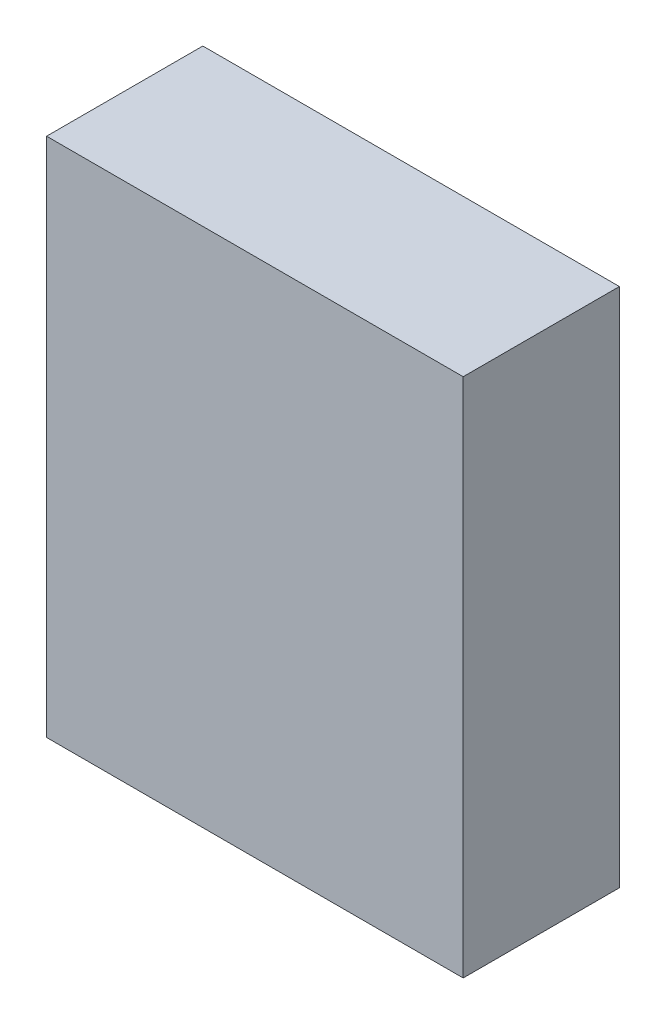
ISO-10303-21;
HEADER;
FILE_DESCRIPTION(('STEP AP214'),'2;1');
FILE_NAME('part.step','',(''),(''),'','','');
FILE_SCHEMA(('AUTOMOTIVE_DESIGN { 1 0 10303 214 1 1 1 1 }'));
ENDSEC;
DATA;
#1=APPLICATION_CONTEXT('core data for automotive mechanical design processes');
#2=APPLICATION_PROTOCOL_DEFINITION('international standard','automotive_design',2000,#1);
#3=PRODUCT_CONTEXT('',#1,'mechanical');
#4=PRODUCT('Part','Part','',(#3));
#5=PRODUCT_RELATED_PRODUCT_CATEGORY('part','',(#4));
#6=PRODUCT_DEFINITION_FORMATION('','',#4);
#7=PRODUCT_DEFINITION_CONTEXT('part definition',#1,'design');
#8=PRODUCT_DEFINITION('design','',#6,#7);
#9=PRODUCT_DEFINITION_SHAPE('','',#8);
#10=(LENGTH_UNIT() NAMED_UNIT(*) SI_UNIT(.MILLI.,.METRE.));
#11=(NAMED_UNIT(*) PLANE_ANGLE_UNIT() SI_UNIT($,.RADIAN.));
#12=(NAMED_UNIT(*) SI_UNIT($,.STERADIAN.) SOLID_ANGLE_UNIT());
#13=UNCERTAINTY_MEASURE_WITH_UNIT(LENGTH_MEASURE(1.E-05),#10,'distance_accuracy_value','');
#14=(GEOMETRIC_REPRESENTATION_CONTEXT(3) GLOBAL_UNCERTAINTY_ASSIGNED_CONTEXT((#13)) GLOBAL_UNIT_ASSIGNED_CONTEXT((#10,
#11,#12)) REPRESENTATION_CONTEXT('',''));
#15=CARTESIAN_POINT('',(0.,0.,0.));
#16=DIRECTION('',(0.,0.,1.));
#17=DIRECTION('',(1.,0.,0.));
#18=AXIS2_PLACEMENT_3D('',#15,#16,#17);
#19=CARTESIAN_POINT('',(-50.8,63.5,38.1));
#20=DIRECTION('',(1.,0.,0.));
#21=DIRECTION('',(0.,1.,0.));
#22=AXIS2_PLACEMENT_3D('',#19,#20,#21);
#23=PLANE('',#22);
#24=DIRECTION('',(0.,-1.,0.));
#25=VECTOR('',#24,1.);
#26=CARTESIAN_POINT('',(-50.8,63.5,0.));
#27=LINE('',#26,#25);
#28=CARTESIAN_POINT('',(-50.8,63.5,0.));
#29=VERTEX_POINT('',#28);
#30=CARTESIAN_POINT('',(-50.8,-63.5,0.));
#31=VERTEX_POINT('',#30);
#32=EDGE_CURVE('E97',#29,#31,#27,.T.);
#33=ORIENTED_EDGE('',*,*,#32,.T.);
#34=DIRECTION('',(0.,0.,-1.));
#35=VECTOR('',#34,1.);
#36=CARTESIAN_POINT('',(-50.8,-63.5,38.1));
#37=LINE('',#36,#35);
#38=CARTESIAN_POINT('',(-50.8,-63.5,38.1));
#39=VERTEX_POINT('',#38);
#40=EDGE_CURVE('E11',#39,#31,#37,.T.);
#41=ORIENTED_EDGE('',*,*,#40,.F.);
#42=DIRECTION('',(0.,-1.,0.));
#43=VECTOR('',#42,1.);
#44=CARTESIAN_POINT('',(-50.8,63.5,38.1));
#45=LINE('',#44,#43);
#46=CARTESIAN_POINT('',(-50.8,63.5,38.1));
#47=VERTEX_POINT('',#46);
#48=EDGE_CURVE('E85',#47,#39,#45,.T.);
#49=ORIENTED_EDGE('',*,*,#48,.F.);
#50=DIRECTION('',(0.,0.,-1.));
#51=VECTOR('',#50,1.);
#52=CARTESIAN_POINT('',(-50.8,63.5,38.1));
#53=LINE('',#52,#51);
#54=EDGE_CURVE('E93',#47,#29,#53,.T.);
#55=ORIENTED_EDGE('',*,*,#54,.T.);
#56=EDGE_LOOP('',(#33,#41,#49,#55));
#57=FACE_BOUND('',#56,.T.);
#58=ADVANCED_FACE('F34',(#57),#23,.F.);
#59=CARTESIAN_POINT('',(-50.8,-63.5,38.1));
#60=DIRECTION('',(0.,1.,0.));
#61=DIRECTION('',(0.,0.,1.));
#62=AXIS2_PLACEMENT_3D('',#59,#60,#61);
#63=PLANE('',#62);
#64=DIRECTION('',(1.,0.,0.));
#65=VECTOR('',#64,1.);
#66=CARTESIAN_POINT('',(-50.8,-63.5,0.));
#67=LINE('',#66,#65);
#68=CARTESIAN_POINT('',(50.8,-63.5,0.));
#69=VERTEX_POINT('',#68);
#70=EDGE_CURVE('E89',#31,#69,#67,.T.);
#71=ORIENTED_EDGE('',*,*,#70,.T.);
#72=DIRECTION('',(0.,0.,-1.));
#73=VECTOR('',#72,1.);
#74=CARTESIAN_POINT('',(50.8,-63.5,38.1));
#75=LINE('',#74,#73);
#76=CARTESIAN_POINT('',(50.8,-63.5,38.1));
#77=VERTEX_POINT('',#76);
#78=EDGE_CURVE('E42',#77,#69,#75,.T.);
#79=ORIENTED_EDGE('',*,*,#78,.F.);
#80=DIRECTION('',(1.,0.,0.));
#81=VECTOR('',#80,1.);
#82=CARTESIAN_POINT('',(-50.8,-63.5,38.1));
#83=LINE('',#82,#81);
#84=EDGE_CURVE('E80',#39,#77,#83,.T.);
#85=ORIENTED_EDGE('',*,*,#84,.F.);
#86=ORIENTED_EDGE('',*,*,#40,.T.);
#87=EDGE_LOOP('',(#71,#79,#85,#86));
#88=FACE_BOUND('',#87,.T.);
#89=ADVANCED_FACE('F88',(#88),#63,.F.);
#90=CARTESIAN_POINT('',(50.8,63.5,38.1));
#91=DIRECTION('',(-1.,0.,0.));
#92=DIRECTION('',(0.,-1.,0.));
#93=AXIS2_PLACEMENT_3D('',#90,#91,#92);
#94=PLANE('',#93);
#95=DIRECTION('',(0.,1.,0.));
#96=VECTOR('',#95,1.);
#97=CARTESIAN_POINT('',(50.8,63.5,0.));
#98=LINE('',#97,#96);
#99=CARTESIAN_POINT('',(50.8,63.5,0.));
#100=VERTEX_POINT('',#99);
#101=EDGE_CURVE('E67',#69,#100,#98,.T.);
#102=ORIENTED_EDGE('',*,*,#101,.T.);
#103=DIRECTION('',(0.,0.,-1.));
#104=VECTOR('',#103,1.);
#105=CARTESIAN_POINT('',(50.8,63.5,38.1));
#106=LINE('',#105,#104);
#107=CARTESIAN_POINT('',(50.8,63.5,38.1));
#108=VERTEX_POINT('',#107);
#109=EDGE_CURVE('E90',#108,#100,#106,.T.);
#110=ORIENTED_EDGE('',*,*,#109,.F.);
#111=DIRECTION('',(0.,1.,0.));
#112=VECTOR('',#111,1.);
#113=CARTESIAN_POINT('',(50.8,63.5,38.1));
#114=LINE('',#113,#112);
#115=EDGE_CURVE('E83',#77,#108,#114,.T.);
#116=ORIENTED_EDGE('',*,*,#115,.F.);
#117=ORIENTED_EDGE('',*,*,#78,.T.);
#118=EDGE_LOOP('',(#102,#110,#116,#117));
#119=FACE_BOUND('',#118,.T.);
#120=ADVANCED_FACE('F91',(#119),#94,.F.);
#121=CARTESIAN_POINT('',(-50.8,63.5,38.1));
#122=DIRECTION('',(0.,-1.,0.));
#123=DIRECTION('',(0.,0.,-1.));
#124=AXIS2_PLACEMENT_3D('',#121,#122,#123);
#125=PLANE('',#124);
#126=DIRECTION('',(-1.,0.,0.));
#127=VECTOR('',#126,1.);
#128=CARTESIAN_POINT('',(-50.8,63.5,0.));
#129=LINE('',#128,#127);
#130=EDGE_CURVE('E73',#100,#29,#129,.T.);
#131=ORIENTED_EDGE('',*,*,#130,.T.);
#132=ORIENTED_EDGE('',*,*,#54,.F.);
#133=DIRECTION('',(-1.,0.,0.));
#134=VECTOR('',#133,1.);
#135=CARTESIAN_POINT('',(-50.8,63.5,38.1));
#136=LINE('',#135,#134);
#137=EDGE_CURVE('E50',#108,#47,#136,.T.);
#138=ORIENTED_EDGE('',*,*,#137,.F.);
#139=ORIENTED_EDGE('',*,*,#109,.T.);
#140=EDGE_LOOP('',(#131,#132,#138,#139));
#141=FACE_BOUND('',#140,.T.);
#142=ADVANCED_FACE('F104',(#141),#125,.F.);
#143=CARTESIAN_POINT('',(0.,0.,38.1));
#144=DIRECTION('',(0.,0.,1.));
#145=DIRECTION('',(1.,0.,0.));
#146=AXIS2_PLACEMENT_3D('',#143,#144,#145);
#147=PLANE('',#146);
#148=ORIENTED_EDGE('',*,*,#48,.T.);
#149=ORIENTED_EDGE('',*,*,#84,.T.);
#150=ORIENTED_EDGE('',*,*,#115,.T.);
#151=ORIENTED_EDGE('',*,*,#137,.T.);
#152=EDGE_LOOP('',(#148,#149,#150,#151));
#153=FACE_BOUND('',#152,.T.);
#154=ADVANCED_FACE('F81',(#153),#147,.T.);
#155=CARTESIAN_POINT('',(0.,0.,0.));
#156=DIRECTION('',(0.,0.,1.));
#157=DIRECTION('',(1.,0.,0.));
#158=AXIS2_PLACEMENT_3D('',#155,#156,#157);
#159=PLANE('',#158);
#160=ORIENTED_EDGE('',*,*,#32,.F.);
#161=ORIENTED_EDGE('',*,*,#130,.F.);
#162=ORIENTED_EDGE('',*,*,#101,.F.);
#163=ORIENTED_EDGE('',*,*,#70,.F.);
#164=EDGE_LOOP('',(#160,#161,#162,#163));
#165=FACE_BOUND('',#164,.T.);
#166=ADVANCED_FACE('F107',(#165),#159,.F.);
#167=CLOSED_SHELL('',(#58,#89,#120,#142,#154,#166));
#168=MANIFOLD_SOLID_BREP('B2',#167);
#169=ADVANCED_BREP_SHAPE_REPRESENTATION('',(#18,#168),#14);
#170=SHAPE_DEFINITION_REPRESENTATION(#9,#169);
ENDSEC;
END-ISO-10303-21;
